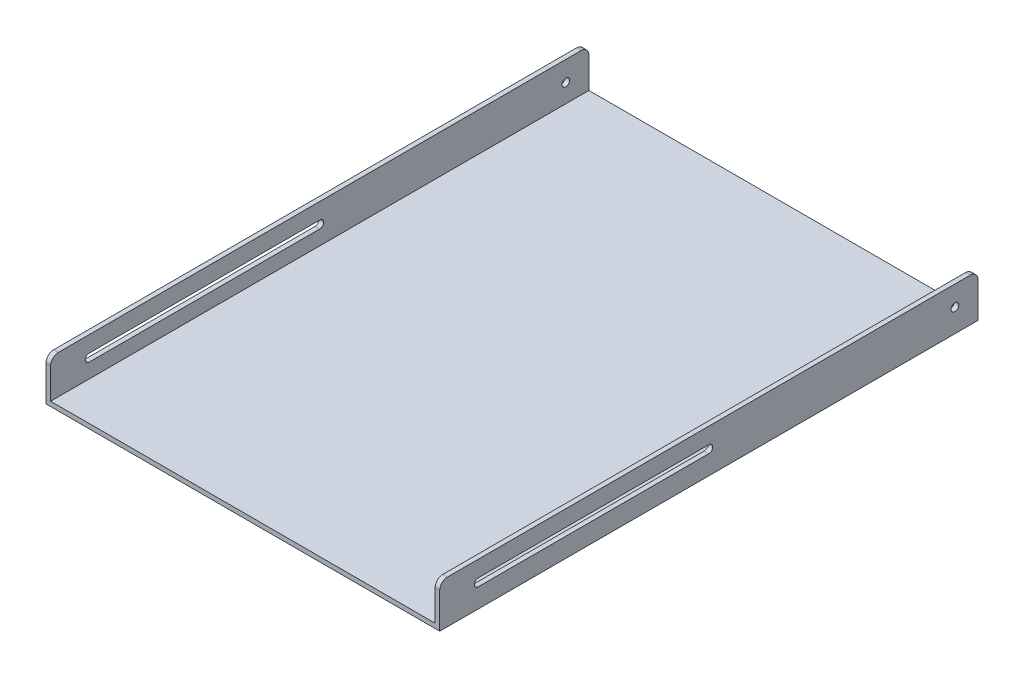
ISO-10303-21;
HEADER;
FILE_DESCRIPTION(('STEP AP214'),'2;1');
FILE_NAME('part.step','',(''),(''),'','','');
FILE_SCHEMA(('AUTOMOTIVE_DESIGN { 1 0 10303 214 1 1 1 1 }'));
ENDSEC;
DATA;
#1=APPLICATION_CONTEXT('core data for automotive mechanical design processes');
#2=APPLICATION_PROTOCOL_DEFINITION('international standard','automotive_design',2000,#1);
#3=PRODUCT_CONTEXT('',#1,'mechanical');
#4=PRODUCT('Part','Part','',(#3));
#5=PRODUCT_RELATED_PRODUCT_CATEGORY('part','',(#4));
#6=PRODUCT_DEFINITION_FORMATION('','',#4);
#7=PRODUCT_DEFINITION_CONTEXT('part definition',#1,'design');
#8=PRODUCT_DEFINITION('design','',#6,#7);
#9=PRODUCT_DEFINITION_SHAPE('','',#8);
#10=(LENGTH_UNIT() NAMED_UNIT(*) SI_UNIT(.MILLI.,.METRE.));
#11=(NAMED_UNIT(*) PLANE_ANGLE_UNIT() SI_UNIT($,.RADIAN.));
#12=(NAMED_UNIT(*) SI_UNIT($,.STERADIAN.) SOLID_ANGLE_UNIT());
#13=UNCERTAINTY_MEASURE_WITH_UNIT(LENGTH_MEASURE(1.E-05),#10,'distance_accuracy_value','');
#14=(GEOMETRIC_REPRESENTATION_CONTEXT(3) GLOBAL_UNCERTAINTY_ASSIGNED_CONTEXT((#13)) GLOBAL_UNIT_ASSIGNED_CONTEXT((#10,
#11,#12)) REPRESENTATION_CONTEXT('',''));
#15=CARTESIAN_POINT('',(0.,0.,0.));
#16=DIRECTION('',(0.,0.,1.));
#17=DIRECTION('',(1.,0.,0.));
#18=AXIS2_PLACEMENT_3D('',#15,#16,#17);
#19=CARTESIAN_POINT('',(256.,0.,350.));
#20=DIRECTION('',(-1.,0.,0.));
#21=DIRECTION('',(0.,0.,1.));
#22=AXIS2_PLACEMENT_3D('',#19,#20,#21);
#23=PLANE('',#22);
#24=CARTESIAN_POINT('',(256.,24.,-320.));
#25=DIRECTION('',(1.,0.,0.));
#26=DIRECTION('',(0.,0.,-1.));
#27=AXIS2_PLACEMENT_3D('',#24,#25,#26);
#28=CIRCLE('',#27,4.99999999999999);
#29=CARTESIAN_POINT('',(256.,24.,-325.));
#30=VERTEX_POINT('',#29);
#31=EDGE_CURVE('E209',#30,#30,#28,.T.);
#32=ORIENTED_EDGE('',*,*,#31,.F.);
#33=EDGE_LOOP('',(#32));
#34=FACE_BOUND('',#33,.T.);
#35=DIRECTION('',(0.,0.,1.));
#36=VECTOR('',#35,1.);
#37=CARTESIAN_POINT('',(256.,29.,0.));
#38=LINE('',#37,#36);
#39=CARTESIAN_POINT('',(256.,29.,0.));
#40=VERTEX_POINT('',#39);
#41=CARTESIAN_POINT('',(256.,28.9999999999999,300.));
#42=VERTEX_POINT('',#41);
#43=EDGE_CURVE('E216',#40,#42,#38,.T.);
#44=ORIENTED_EDGE('',*,*,#43,.F.);
#45=CARTESIAN_POINT('',(256.,24.,0.));
#46=DIRECTION('',(1.,0.,0.));
#47=DIRECTION('',(0.,0.,-1.));
#48=AXIS2_PLACEMENT_3D('',#45,#46,#47);
#49=CIRCLE('',#48,5.);
#50=CARTESIAN_POINT('',(256.,19.,0.));
#51=VERTEX_POINT('',#50);
#52=EDGE_CURVE('E214',#51,#40,#49,.T.);
#53=ORIENTED_EDGE('',*,*,#52,.F.);
#54=DIRECTION('',(0.,0.,-1.));
#55=VECTOR('',#54,1.);
#56=CARTESIAN_POINT('',(256.,19.,0.));
#57=LINE('',#56,#55);
#58=CARTESIAN_POINT('',(256.,18.9999999999999,300.));
#59=VERTEX_POINT('',#58);
#60=EDGE_CURVE('E203',#59,#51,#57,.T.);
#61=ORIENTED_EDGE('',*,*,#60,.F.);
#62=CARTESIAN_POINT('',(256.,23.9999999999999,300.));
#63=DIRECTION('',(1.,0.,0.));
#64=DIRECTION('',(0.,0.,-1.));
#65=AXIS2_PLACEMENT_3D('',#62,#63,#64);
#66=CIRCLE('',#65,5.);
#67=EDGE_CURVE('E206',#42,#59,#66,.T.);
#68=ORIENTED_EDGE('',*,*,#67,.F.);
#69=EDGE_LOOP('',(#44,#53,#61,#68));
#70=FACE_BOUND('',#69,.T.);
#71=DIRECTION('',(0.,1.,0.));
#72=VECTOR('',#71,1.);
#73=CARTESIAN_POINT('',(256.,0.,-350.));
#74=LINE('',#73,#72);
#75=CARTESIAN_POINT('',(256.,-6.,-350.));
#76=VERTEX_POINT('',#75);
#77=CARTESIAN_POINT('',(256.,40.,-350.));
#78=VERTEX_POINT('',#77);
#79=EDGE_CURVE('E252',#76,#78,#74,.T.);
#80=ORIENTED_EDGE('',*,*,#79,.T.);
#81=CARTESIAN_POINT('',(256.,40.,-340.));
#82=DIRECTION('',(-1.,0.,0.));
#83=DIRECTION('',(0.,0.,1.));
#84=AXIS2_PLACEMENT_3D('',#81,#82,#83);
#85=CIRCLE('',#84,10.);
#86=CARTESIAN_POINT('',(256.,50.,-340.));
#87=VERTEX_POINT('',#86);
#88=EDGE_CURVE('E322',#78,#87,#85,.F.);
#89=ORIENTED_EDGE('',*,*,#88,.T.);
#90=DIRECTION('',(0.,0.,-1.));
#91=VECTOR('',#90,1.);
#92=CARTESIAN_POINT('',(256.,50.,350.));
#93=LINE('',#92,#91);
#94=CARTESIAN_POINT('',(256.,50.,340.));
#95=VERTEX_POINT('',#94);
#96=EDGE_CURVE('E299',#95,#87,#93,.T.);
#97=ORIENTED_EDGE('',*,*,#96,.F.);
#98=CARTESIAN_POINT('',(256.,40.,340.));
#99=DIRECTION('',(-1.,0.,0.));
#100=DIRECTION('',(0.,0.,1.));
#101=AXIS2_PLACEMENT_3D('',#98,#99,#100);
#102=CIRCLE('',#101,10.);
#103=CARTESIAN_POINT('',(256.,40.,350.));
#104=VERTEX_POINT('',#103);
#105=EDGE_CURVE('E320',#95,#104,#102,.F.);
#106=ORIENTED_EDGE('',*,*,#105,.T.);
#107=DIRECTION('',(0.,1.,0.));
#108=VECTOR('',#107,1.);
#109=CARTESIAN_POINT('',(256.,0.,350.));
#110=LINE('',#109,#108);
#111=CARTESIAN_POINT('',(256.,-6.,350.));
#112=VERTEX_POINT('',#111);
#113=EDGE_CURVE('E253',#112,#104,#110,.T.);
#114=ORIENTED_EDGE('',*,*,#113,.F.);
#115=DIRECTION('',(0.,0.,-1.));
#116=VECTOR('',#115,1.);
#117=CARTESIAN_POINT('',(256.,-6.,350.));
#118=LINE('',#117,#116);
#119=EDGE_CURVE('E267',#112,#76,#118,.T.);
#120=ORIENTED_EDGE('',*,*,#119,.T.);
#121=EDGE_LOOP('',(#80,#89,#97,#106,#114,#120));
#122=FACE_BOUND('',#121,.T.);
#123=ADVANCED_FACE('F36',(#34,#70,#122),#23,.F.);
#124=CARTESIAN_POINT('',(250.,50.,350.));
#125=DIRECTION('',(0.,1.,0.));
#126=DIRECTION('',(0.,0.,1.));
#127=AXIS2_PLACEMENT_3D('',#124,#125,#126);
#128=PLANE('',#127);
#129=ORIENTED_EDGE('',*,*,#96,.T.);
#130=DIRECTION('',(1.,0.,0.));
#131=VECTOR('',#130,1.);
#132=CARTESIAN_POINT('',(250.,50.,-340.));
#133=LINE('',#132,#131);
#134=CARTESIAN_POINT('',(250.,50.,-340.));
#135=VERTEX_POINT('',#134);
#136=EDGE_CURVE('E57',#87,#135,#133,.F.);
#137=ORIENTED_EDGE('',*,*,#136,.T.);
#138=DIRECTION('',(0.,0.,-1.));
#139=VECTOR('',#138,1.);
#140=CARTESIAN_POINT('',(250.,50.,350.));
#141=LINE('',#140,#139);
#142=CARTESIAN_POINT('',(250.,50.,340.));
#143=VERTEX_POINT('',#142);
#144=EDGE_CURVE('E297',#143,#135,#141,.T.);
#145=ORIENTED_EDGE('',*,*,#144,.F.);
#146=DIRECTION('',(1.,0.,0.));
#147=VECTOR('',#146,1.);
#148=CARTESIAN_POINT('',(256.,50.,340.));
#149=LINE('',#148,#147);
#150=EDGE_CURVE('E324',#143,#95,#149,.T.);
#151=ORIENTED_EDGE('',*,*,#150,.T.);
#152=EDGE_LOOP('',(#129,#137,#145,#151));
#153=FACE_BOUND('',#152,.T.);
#154=ADVANCED_FACE('F370',(#153),#128,.T.);
#155=CARTESIAN_POINT('',(250.,0.,350.));
#156=DIRECTION('',(-1.,0.,0.));
#157=DIRECTION('',(0.,0.,1.));
#158=AXIS2_PLACEMENT_3D('',#155,#156,#157);
#159=PLANE('',#158);
#160=CARTESIAN_POINT('',(250.,24.,-320.));
#161=DIRECTION('',(-1.,0.,0.));
#162=DIRECTION('',(0.,0.,1.));
#163=AXIS2_PLACEMENT_3D('',#160,#161,#162);
#164=CIRCLE('',#163,4.99999999999999);
#165=CARTESIAN_POINT('',(250.,24.,-315.));
#166=VERTEX_POINT('',#165);
#167=EDGE_CURVE('E249',#166,#166,#164,.T.);
#168=ORIENTED_EDGE('',*,*,#167,.F.);
#169=EDGE_LOOP('',(#168));
#170=FACE_BOUND('',#169,.T.);
#171=CARTESIAN_POINT('',(250.,24.,0.));
#172=DIRECTION('',(-1.,0.,0.));
#173=DIRECTION('',(0.,0.,1.));
#174=AXIS2_PLACEMENT_3D('',#171,#172,#173);
#175=CIRCLE('',#174,5.);
#176=CARTESIAN_POINT('',(250.,29.,0.));
#177=VERTEX_POINT('',#176);
#178=CARTESIAN_POINT('',(250.,19.,0.));
#179=VERTEX_POINT('',#178);
#180=EDGE_CURVE('E244',#177,#179,#175,.T.);
#181=ORIENTED_EDGE('',*,*,#180,.F.);
#182=DIRECTION('',(0.,0.,-1.));
#183=VECTOR('',#182,1.);
#184=CARTESIAN_POINT('',(250.,28.9999999999999,350.));
#185=LINE('',#184,#183);
#186=CARTESIAN_POINT('',(250.,28.9999999999999,300.));
#187=VERTEX_POINT('',#186);
#188=EDGE_CURVE('E231',#187,#177,#185,.T.);
#189=ORIENTED_EDGE('',*,*,#188,.F.);
#190=CARTESIAN_POINT('',(250.,23.9999999999999,300.));
#191=DIRECTION('',(-1.,0.,0.));
#192=DIRECTION('',(0.,0.,1.));
#193=AXIS2_PLACEMENT_3D('',#190,#191,#192);
#194=CIRCLE('',#193,5.);
#195=CARTESIAN_POINT('',(250.,18.9999999999999,300.));
#196=VERTEX_POINT('',#195);
#197=EDGE_CURVE('E236',#196,#187,#194,.T.);
#198=ORIENTED_EDGE('',*,*,#197,.F.);
#199=DIRECTION('',(0.,0.,1.));
#200=VECTOR('',#199,1.);
#201=CARTESIAN_POINT('',(250.,18.9999999999999,350.));
#202=LINE('',#201,#200);
#203=EDGE_CURVE('E241',#179,#196,#202,.T.);
#204=ORIENTED_EDGE('',*,*,#203,.F.);
#205=EDGE_LOOP('',(#181,#189,#198,#204));
#206=FACE_BOUND('',#205,.T.);
#207=ORIENTED_EDGE('',*,*,#144,.T.);
#208=CARTESIAN_POINT('',(250.,40.,-340.));
#209=DIRECTION('',(-1.,0.,0.));
#210=DIRECTION('',(0.,0.,1.));
#211=AXIS2_PLACEMENT_3D('',#208,#209,#210);
#212=CIRCLE('',#211,10.);
#213=CARTESIAN_POINT('',(250.,40.,-350.));
#214=VERTEX_POINT('',#213);
#215=EDGE_CURVE('E330',#135,#214,#212,.T.);
#216=ORIENTED_EDGE('',*,*,#215,.T.);
#217=DIRECTION('',(0.,1.,0.));
#218=VECTOR('',#217,1.);
#219=CARTESIAN_POINT('',(250.,0.,-350.));
#220=LINE('',#219,#218);
#221=CARTESIAN_POINT('',(250.,0.,-350.));
#222=VERTEX_POINT('',#221);
#223=EDGE_CURVE('E270',#222,#214,#220,.T.);
#224=ORIENTED_EDGE('',*,*,#223,.F.);
#225=DIRECTION('',(0.,0.,-1.));
#226=VECTOR('',#225,1.);
#227=CARTESIAN_POINT('',(250.,0.,350.));
#228=LINE('',#227,#226);
#229=CARTESIAN_POINT('',(250.,0.,350.));
#230=VERTEX_POINT('',#229);
#231=EDGE_CURVE('E295',#230,#222,#228,.T.);
#232=ORIENTED_EDGE('',*,*,#231,.F.);
#233=DIRECTION('',(0.,1.,0.));
#234=VECTOR('',#233,1.);
#235=CARTESIAN_POINT('',(250.,0.,350.));
#236=LINE('',#235,#234);
#237=CARTESIAN_POINT('',(250.,40.,350.));
#238=VERTEX_POINT('',#237);
#239=EDGE_CURVE('E255',#230,#238,#236,.T.);
#240=ORIENTED_EDGE('',*,*,#239,.T.);
#241=CARTESIAN_POINT('',(250.,40.,340.));
#242=DIRECTION('',(-1.,0.,0.));
#243=DIRECTION('',(0.,0.,1.));
#244=AXIS2_PLACEMENT_3D('',#241,#242,#243);
#245=CIRCLE('',#244,10.);
#246=EDGE_CURVE('E328',#238,#143,#245,.T.);
#247=ORIENTED_EDGE('',*,*,#246,.T.);
#248=EDGE_LOOP('',(#207,#216,#224,#232,#240,#247));
#249=FACE_BOUND('',#248,.T.);
#250=ADVANCED_FACE('F368',(#170,#206,#249),#159,.T.);
#251=CARTESIAN_POINT('',(-250.,0.,350.));
#252=DIRECTION('',(0.,1.,0.));
#253=DIRECTION('',(0.,0.,1.));
#254=AXIS2_PLACEMENT_3D('',#251,#252,#253);
#255=PLANE('',#254);
#256=DIRECTION('',(1.,0.,0.));
#257=VECTOR('',#256,1.);
#258=CARTESIAN_POINT('',(-250.,0.,-350.));
#259=LINE('',#258,#257);
#260=CARTESIAN_POINT('',(-250.,0.,-350.));
#261=VERTEX_POINT('',#260);
#262=EDGE_CURVE('E273',#261,#222,#259,.T.);
#263=ORIENTED_EDGE('',*,*,#262,.F.);
#264=DIRECTION('',(0.,0.,-1.));
#265=VECTOR('',#264,1.);
#266=CARTESIAN_POINT('',(-250.,0.,350.));
#267=LINE('',#266,#265);
#268=CARTESIAN_POINT('',(-250.,0.,350.));
#269=VERTEX_POINT('',#268);
#270=EDGE_CURVE('E292',#269,#261,#267,.T.);
#271=ORIENTED_EDGE('',*,*,#270,.F.);
#272=DIRECTION('',(1.,0.,0.));
#273=VECTOR('',#272,1.);
#274=CARTESIAN_POINT('',(-250.,0.,350.));
#275=LINE('',#274,#273);
#276=EDGE_CURVE('E258',#269,#230,#275,.T.);
#277=ORIENTED_EDGE('',*,*,#276,.T.);
#278=ORIENTED_EDGE('',*,*,#231,.T.);
#279=EDGE_LOOP('',(#263,#271,#277,#278));
#280=FACE_BOUND('',#279,.T.);
#281=ADVANCED_FACE('F379',(#280),#255,.T.);
#282=CARTESIAN_POINT('',(-250.,50.,350.));
#283=DIRECTION('',(1.,0.,0.));
#284=DIRECTION('',(0.,0.,-1.));
#285=AXIS2_PLACEMENT_3D('',#282,#283,#284);
#286=PLANE('',#285);
#287=CARTESIAN_POINT('',(-250.,24.,-320.));
#288=DIRECTION('',(1.,0.,0.));
#289=DIRECTION('',(0.,0.,-1.));
#290=AXIS2_PLACEMENT_3D('',#287,#288,#289);
#291=CIRCLE('',#290,4.99999999999999);
#292=CARTESIAN_POINT('',(-250.,24.,-325.));
#293=VERTEX_POINT('',#292);
#294=EDGE_CURVE('E246',#293,#293,#291,.T.);
#295=ORIENTED_EDGE('',*,*,#294,.F.);
#296=EDGE_LOOP('',(#295));
#297=FACE_BOUND('',#296,.T.);
#298=CARTESIAN_POINT('',(-250.,24.,0.));
#299=DIRECTION('',(1.,0.,0.));
#300=DIRECTION('',(0.,0.,-1.));
#301=AXIS2_PLACEMENT_3D('',#298,#299,#300);
#302=CIRCLE('',#301,5.);
#303=CARTESIAN_POINT('',(-250.,19.,0.));
#304=VERTEX_POINT('',#303);
#305=CARTESIAN_POINT('',(-250.,29.,0.));
#306=VERTEX_POINT('',#305);
#307=EDGE_CURVE('E183',#304,#306,#302,.T.);
#308=ORIENTED_EDGE('',*,*,#307,.F.);
#309=DIRECTION('',(0.,0.,-1.));
#310=VECTOR('',#309,1.);
#311=CARTESIAN_POINT('',(-250.,18.9999999999999,350.));
#312=LINE('',#311,#310);
#313=CARTESIAN_POINT('',(-250.,18.9999999999999,300.));
#314=VERTEX_POINT('',#313);
#315=EDGE_CURVE('E239',#314,#304,#312,.T.);
#316=ORIENTED_EDGE('',*,*,#315,.F.);
#317=CARTESIAN_POINT('',(-250.,23.9999999999999,300.));
#318=DIRECTION('',(1.,0.,0.));
#319=DIRECTION('',(0.,0.,-1.));
#320=AXIS2_PLACEMENT_3D('',#317,#318,#319);
#321=CIRCLE('',#320,5.);
#322=CARTESIAN_POINT('',(-250.,28.9999999999999,300.));
#323=VERTEX_POINT('',#322);
#324=EDGE_CURVE('E234',#323,#314,#321,.T.);
#325=ORIENTED_EDGE('',*,*,#324,.F.);
#326=DIRECTION('',(0.,0.,1.));
#327=VECTOR('',#326,1.);
#328=CARTESIAN_POINT('',(-250.,28.9999999999999,350.));
#329=LINE('',#328,#327);
#330=EDGE_CURVE('E229',#306,#323,#329,.T.);
#331=ORIENTED_EDGE('',*,*,#330,.F.);
#332=EDGE_LOOP('',(#308,#316,#325,#331));
#333=FACE_BOUND('',#332,.T.);
#334=DIRECTION('',(0.,-1.,0.));
#335=VECTOR('',#334,1.);
#336=CARTESIAN_POINT('',(-250.,50.,-350.));
#337=LINE('',#336,#335);
#338=CARTESIAN_POINT('',(-250.,40.,-350.));
#339=VERTEX_POINT('',#338);
#340=EDGE_CURVE('E276',#339,#261,#337,.T.);
#341=ORIENTED_EDGE('',*,*,#340,.F.);
#342=CARTESIAN_POINT('',(-250.,40.,-340.));
#343=DIRECTION('',(1.,0.,0.));
#344=DIRECTION('',(0.,0.,-1.));
#345=AXIS2_PLACEMENT_3D('',#342,#343,#344);
#346=CIRCLE('',#345,10.);
#347=CARTESIAN_POINT('',(-250.,50.,-340.));
#348=VERTEX_POINT('',#347);
#349=EDGE_CURVE('E309',#339,#348,#346,.T.);
#350=ORIENTED_EDGE('',*,*,#349,.T.);
#351=DIRECTION('',(0.,0.,-1.));
#352=VECTOR('',#351,1.);
#353=CARTESIAN_POINT('',(-250.,50.,350.));
#354=LINE('',#353,#352);
#355=CARTESIAN_POINT('',(-250.,50.,340.));
#356=VERTEX_POINT('',#355);
#357=EDGE_CURVE('E289',#356,#348,#354,.T.);
#358=ORIENTED_EDGE('',*,*,#357,.F.);
#359=CARTESIAN_POINT('',(-250.,40.,340.));
#360=DIRECTION('',(1.,0.,0.));
#361=DIRECTION('',(0.,0.,-1.));
#362=AXIS2_PLACEMENT_3D('',#359,#360,#361);
#363=CIRCLE('',#362,10.);
#364=CARTESIAN_POINT('',(-250.,40.,350.));
#365=VERTEX_POINT('',#364);
#366=EDGE_CURVE('E307',#356,#365,#363,.T.);
#367=ORIENTED_EDGE('',*,*,#366,.T.);
#368=DIRECTION('',(0.,-1.,0.));
#369=VECTOR('',#368,1.);
#370=CARTESIAN_POINT('',(-250.,50.,350.));
#371=LINE('',#370,#369);
#372=EDGE_CURVE('E261',#365,#269,#371,.T.);
#373=ORIENTED_EDGE('',*,*,#372,.T.);
#374=ORIENTED_EDGE('',*,*,#270,.T.);
#375=EDGE_LOOP('',(#341,#350,#358,#367,#373,#374));
#376=FACE_BOUND('',#375,.T.);
#377=ADVANCED_FACE('F348',(#297,#333,#376),#286,.T.);
#378=CARTESIAN_POINT('',(-256.,50.,350.));
#379=DIRECTION('',(0.,1.,0.));
#380=DIRECTION('',(0.,0.,1.));
#381=AXIS2_PLACEMENT_3D('',#378,#379,#380);
#382=PLANE('',#381);
#383=ORIENTED_EDGE('',*,*,#357,.T.);
#384=DIRECTION('',(1.,0.,0.));
#385=VECTOR('',#384,1.);
#386=CARTESIAN_POINT('',(-256.,50.,-340.));
#387=LINE('',#386,#385);
#388=CARTESIAN_POINT('',(-256.,50.,-340.));
#389=VERTEX_POINT('',#388);
#390=EDGE_CURVE('E314',#348,#389,#387,.F.);
#391=ORIENTED_EDGE('',*,*,#390,.T.);
#392=DIRECTION('',(0.,0.,-1.));
#393=VECTOR('',#392,1.);
#394=CARTESIAN_POINT('',(-256.,50.,350.));
#395=LINE('',#394,#393);
#396=CARTESIAN_POINT('',(-256.,50.,340.));
#397=VERTEX_POINT('',#396);
#398=EDGE_CURVE('E286',#397,#389,#395,.T.);
#399=ORIENTED_EDGE('',*,*,#398,.F.);
#400=DIRECTION('',(1.,0.,0.));
#401=VECTOR('',#400,1.);
#402=CARTESIAN_POINT('',(-250.,50.,340.));
#403=LINE('',#402,#401);
#404=EDGE_CURVE('E311',#397,#356,#403,.T.);
#405=ORIENTED_EDGE('',*,*,#404,.T.);
#406=EDGE_LOOP('',(#383,#391,#399,#405));
#407=FACE_BOUND('',#406,.T.);
#408=ADVANCED_FACE('F344',(#407),#382,.T.);
#409=CARTESIAN_POINT('',(-256.,50.,350.));
#410=DIRECTION('',(1.,0.,0.));
#411=DIRECTION('',(0.,0.,-1.));
#412=AXIS2_PLACEMENT_3D('',#409,#410,#411);
#413=PLANE('',#412);
#414=CARTESIAN_POINT('',(-256.,24.,-320.));
#415=DIRECTION('',(1.,0.,0.));
#416=DIRECTION('',(0.,0.,-1.));
#417=AXIS2_PLACEMENT_3D('',#414,#415,#416);
#418=CIRCLE('',#417,4.99999999999999);
#419=CARTESIAN_POINT('',(-256.,24.,-325.));
#420=VERTEX_POINT('',#419);
#421=EDGE_CURVE('E232',#420,#420,#418,.T.);
#422=ORIENTED_EDGE('',*,*,#421,.T.);
#423=EDGE_LOOP('',(#422));
#424=FACE_BOUND('',#423,.T.);
#425=DIRECTION('',(0.,0.,-1.));
#426=VECTOR('',#425,1.);
#427=CARTESIAN_POINT('',(-256.,19.,0.));
#428=LINE('',#427,#426);
#429=CARTESIAN_POINT('',(-256.,18.9999999999999,300.));
#430=VERTEX_POINT('',#429);
#431=CARTESIAN_POINT('',(-256.,19.,0.));
#432=VERTEX_POINT('',#431);
#433=EDGE_CURVE('E202',#430,#432,#428,.T.);
#434=ORIENTED_EDGE('',*,*,#433,.T.);
#435=CARTESIAN_POINT('',(-256.,24.,0.));
#436=DIRECTION('',(1.,0.,0.));
#437=DIRECTION('',(0.,0.,-1.));
#438=AXIS2_PLACEMENT_3D('',#435,#436,#437);
#439=CIRCLE('',#438,5.);
#440=CARTESIAN_POINT('',(-256.,29.,0.));
#441=VERTEX_POINT('',#440);
#442=EDGE_CURVE('E180',#432,#441,#439,.T.);
#443=ORIENTED_EDGE('',*,*,#442,.T.);
#444=DIRECTION('',(0.,0.,1.));
#445=VECTOR('',#444,1.);
#446=CARTESIAN_POINT('',(-256.,29.,0.));
#447=LINE('',#446,#445);
#448=CARTESIAN_POINT('',(-256.,28.9999999999999,300.));
#449=VERTEX_POINT('',#448);
#450=EDGE_CURVE('E191',#441,#449,#447,.T.);
#451=ORIENTED_EDGE('',*,*,#450,.T.);
#452=CARTESIAN_POINT('',(-256.,23.9999999999999,300.));
#453=DIRECTION('',(1.,0.,0.));
#454=DIRECTION('',(0.,0.,-1.));
#455=AXIS2_PLACEMENT_3D('',#452,#453,#454);
#456=CIRCLE('',#455,5.);
#457=EDGE_CURVE('E197',#449,#430,#456,.T.);
#458=ORIENTED_EDGE('',*,*,#457,.T.);
#459=EDGE_LOOP('',(#434,#443,#451,#458));
#460=FACE_BOUND('',#459,.T.);
#461=ORIENTED_EDGE('',*,*,#398,.T.);
#462=CARTESIAN_POINT('',(-256.,40.,-340.));
#463=DIRECTION('',(1.,0.,0.));
#464=DIRECTION('',(0.,0.,-1.));
#465=AXIS2_PLACEMENT_3D('',#462,#463,#464);
#466=CIRCLE('',#465,10.);
#467=CARTESIAN_POINT('',(-256.,40.,-350.));
#468=VERTEX_POINT('',#467);
#469=EDGE_CURVE('E318',#389,#468,#466,.F.);
#470=ORIENTED_EDGE('',*,*,#469,.T.);
#471=DIRECTION('',(0.,1.,0.));
#472=VECTOR('',#471,1.);
#473=CARTESIAN_POINT('',(-256.,50.,-350.));
#474=LINE('',#473,#472);
#475=CARTESIAN_POINT('',(-256.,-6.,-350.));
#476=VERTEX_POINT('',#475);
#477=EDGE_CURVE('E278',#468,#476,#474,.F.);
#478=ORIENTED_EDGE('',*,*,#477,.T.);
#479=DIRECTION('',(0.,0.,-1.));
#480=VECTOR('',#479,1.);
#481=CARTESIAN_POINT('',(-256.,-6.,350.));
#482=LINE('',#481,#480);
#483=CARTESIAN_POINT('',(-256.,-6.,350.));
#484=VERTEX_POINT('',#483);
#485=EDGE_CURVE('E283',#484,#476,#482,.T.);
#486=ORIENTED_EDGE('',*,*,#485,.F.);
#487=DIRECTION('',(0.,1.,0.));
#488=VECTOR('',#487,1.);
#489=CARTESIAN_POINT('',(-256.,50.,350.));
#490=LINE('',#489,#488);
#491=CARTESIAN_POINT('',(-256.,40.,350.));
#492=VERTEX_POINT('',#491);
#493=EDGE_CURVE('E263',#492,#484,#490,.F.);
#494=ORIENTED_EDGE('',*,*,#493,.F.);
#495=CARTESIAN_POINT('',(-256.,40.,340.));
#496=DIRECTION('',(1.,0.,0.));
#497=DIRECTION('',(0.,0.,-1.));
#498=AXIS2_PLACEMENT_3D('',#495,#496,#497);
#499=CIRCLE('',#498,10.);
#500=EDGE_CURVE('E316',#492,#397,#499,.F.);
#501=ORIENTED_EDGE('',*,*,#500,.T.);
#502=EDGE_LOOP('',(#461,#470,#478,#486,#494,#501));
#503=FACE_BOUND('',#502,.T.);
#504=ADVANCED_FACE('F199',(#424,#460,#503),#413,.F.);
#505=CARTESIAN_POINT('',(-250.,-6.,350.));
#506=DIRECTION('',(0.,1.,0.));
#507=DIRECTION('',(0.,0.,1.));
#508=AXIS2_PLACEMENT_3D('',#505,#506,#507);
#509=PLANE('',#508);
#510=DIRECTION('',(1.,0.,0.));
#511=VECTOR('',#510,1.);
#512=CARTESIAN_POINT('',(-250.,-6.,-350.));
#513=LINE('',#512,#511);
#514=EDGE_CURVE('E256',#476,#76,#513,.T.);
#515=ORIENTED_EDGE('',*,*,#514,.T.);
#516=ORIENTED_EDGE('',*,*,#119,.F.);
#517=DIRECTION('',(1.,0.,0.));
#518=VECTOR('',#517,1.);
#519=CARTESIAN_POINT('',(-250.,-6.,350.));
#520=LINE('',#519,#518);
#521=EDGE_CURVE('E265',#484,#112,#520,.T.);
#522=ORIENTED_EDGE('',*,*,#521,.F.);
#523=ORIENTED_EDGE('',*,*,#485,.T.);
#524=EDGE_LOOP('',(#515,#516,#522,#523));
#525=FACE_BOUND('',#524,.T.);
#526=ADVANCED_FACE('F359',(#525),#509,.F.);
#527=CARTESIAN_POINT('',(0.,0.,350.));
#528=DIRECTION('',(0.,0.,-1.));
#529=DIRECTION('',(-1.,0.,0.));
#530=AXIS2_PLACEMENT_3D('',#527,#528,#529);
#531=PLANE('',#530);
#532=ORIENTED_EDGE('',*,*,#113,.T.);
#533=DIRECTION('',(1.,0.,0.));
#534=VECTOR('',#533,1.);
#535=CARTESIAN_POINT('',(250.,40.,350.));
#536=LINE('',#535,#534);
#537=EDGE_CURVE('E11',#104,#238,#536,.F.);
#538=ORIENTED_EDGE('',*,*,#537,.T.);
#539=ORIENTED_EDGE('',*,*,#239,.F.);
#540=ORIENTED_EDGE('',*,*,#276,.F.);
#541=ORIENTED_EDGE('',*,*,#372,.F.);
#542=DIRECTION('',(1.,0.,0.));
#543=VECTOR('',#542,1.);
#544=CARTESIAN_POINT('',(-256.,40.,350.));
#545=LINE('',#544,#543);
#546=EDGE_CURVE('E44',#365,#492,#545,.F.);
#547=ORIENTED_EDGE('',*,*,#546,.T.);
#548=ORIENTED_EDGE('',*,*,#493,.T.);
#549=ORIENTED_EDGE('',*,*,#521,.T.);
#550=EDGE_LOOP('',(#532,#538,#539,#540,#541,#547,#548,#549));
#551=FACE_BOUND('',#550,.T.);
#552=ADVANCED_FACE('F334',(#551),#531,.F.);
#553=CARTESIAN_POINT('',(0.,0.,-350.));
#554=DIRECTION('',(0.,0.,-1.));
#555=DIRECTION('',(-1.,0.,0.));
#556=AXIS2_PLACEMENT_3D('',#553,#554,#555);
#557=PLANE('',#556);
#558=ORIENTED_EDGE('',*,*,#477,.F.);
#559=DIRECTION('',(1.,0.,0.));
#560=VECTOR('',#559,1.);
#561=CARTESIAN_POINT('',(0.,40.,-350.));
#562=LINE('',#561,#560);
#563=EDGE_CURVE('E304',#468,#339,#562,.T.);
#564=ORIENTED_EDGE('',*,*,#563,.T.);
#565=ORIENTED_EDGE('',*,*,#340,.T.);
#566=ORIENTED_EDGE('',*,*,#262,.T.);
#567=ORIENTED_EDGE('',*,*,#223,.T.);
#568=DIRECTION('',(1.,0.,0.));
#569=VECTOR('',#568,1.);
#570=CARTESIAN_POINT('',(0.,40.,-350.));
#571=LINE('',#570,#569);
#572=EDGE_CURVE('E301',#214,#78,#571,.T.);
#573=ORIENTED_EDGE('',*,*,#572,.T.);
#574=ORIENTED_EDGE('',*,*,#79,.F.);
#575=ORIENTED_EDGE('',*,*,#514,.F.);
#576=EDGE_LOOP('',(#558,#564,#565,#566,#567,#573,#574,#575));
#577=FACE_BOUND('',#576,.T.);
#578=ADVANCED_FACE('F355',(#577),#557,.T.);
#579=CARTESIAN_POINT('',(-256.,29.,0.));
#580=DIRECTION('',(0.,1.,0.));
#581=DIRECTION('',(0.,0.,1.));
#582=AXIS2_PLACEMENT_3D('',#579,#580,#581);
#583=PLANE('',#582);
#584=ORIENTED_EDGE('',*,*,#330,.T.);
#585=DIRECTION('',(1.,0.,0.));
#586=VECTOR('',#585,1.);
#587=CARTESIAN_POINT('',(-256.,28.9999999999999,300.));
#588=LINE('',#587,#586);
#589=EDGE_CURVE('E194',#449,#323,#588,.T.);
#590=ORIENTED_EDGE('',*,*,#589,.F.);
#591=ORIENTED_EDGE('',*,*,#450,.F.);
#592=DIRECTION('',(1.,0.,0.));
#593=VECTOR('',#592,1.);
#594=CARTESIAN_POINT('',(-256.,29.,0.));
#595=LINE('',#594,#593);
#596=EDGE_CURVE('E175',#441,#306,#595,.T.);
#597=ORIENTED_EDGE('',*,*,#596,.T.);
#598=EDGE_LOOP('',(#584,#590,#591,#597));
#599=FACE_BOUND('',#598,.T.);
#600=ADVANCED_FACE('F192',(#599),#583,.F.);
#601=CARTESIAN_POINT('',(-256.,23.9999999999999,300.));
#602=DIRECTION('',(1.,0.,0.));
#603=DIRECTION('',(0.,0.,-1.));
#604=AXIS2_PLACEMENT_3D('',#601,#602,#603);
#605=CYLINDRICAL_SURFACE('',#604,5.);
#606=ORIENTED_EDGE('',*,*,#324,.T.);
#607=DIRECTION('',(1.,0.,0.));
#608=VECTOR('',#607,1.);
#609=CARTESIAN_POINT('',(-256.,18.9999999999999,300.));
#610=LINE('',#609,#608);
#611=EDGE_CURVE('E224',#430,#314,#610,.T.);
#612=ORIENTED_EDGE('',*,*,#611,.F.);
#613=ORIENTED_EDGE('',*,*,#457,.F.);
#614=ORIENTED_EDGE('',*,*,#589,.T.);
#615=EDGE_LOOP('',(#606,#612,#613,#614));
#616=FACE_BOUND('',#615,.T.);
#617=ADVANCED_FACE('F519',(#616),#605,.F.);
#618=CARTESIAN_POINT('',(-256.,19.,0.));
#619=DIRECTION('',(0.,-1.,0.));
#620=DIRECTION('',(0.,0.,-1.));
#621=AXIS2_PLACEMENT_3D('',#618,#619,#620);
#622=PLANE('',#621);
#623=ORIENTED_EDGE('',*,*,#315,.T.);
#624=DIRECTION('',(1.,0.,0.));
#625=VECTOR('',#624,1.);
#626=CARTESIAN_POINT('',(-256.,19.,0.));
#627=LINE('',#626,#625);
#628=EDGE_CURVE('E221',#432,#304,#627,.T.);
#629=ORIENTED_EDGE('',*,*,#628,.F.);
#630=ORIENTED_EDGE('',*,*,#433,.F.);
#631=ORIENTED_EDGE('',*,*,#611,.T.);
#632=EDGE_LOOP('',(#623,#629,#630,#631));
#633=FACE_BOUND('',#632,.T.);
#634=ADVANCED_FACE('F530',(#633),#622,.F.);
#635=CARTESIAN_POINT('',(-256.,24.,0.));
#636=DIRECTION('',(1.,0.,0.));
#637=DIRECTION('',(0.,0.,-1.));
#638=AXIS2_PLACEMENT_3D('',#635,#636,#637);
#639=CYLINDRICAL_SURFACE('',#638,5.);
#640=ORIENTED_EDGE('',*,*,#307,.T.);
#641=ORIENTED_EDGE('',*,*,#596,.F.);
#642=ORIENTED_EDGE('',*,*,#442,.F.);
#643=ORIENTED_EDGE('',*,*,#628,.T.);
#644=EDGE_LOOP('',(#640,#641,#642,#643));
#645=FACE_BOUND('',#644,.T.);
#646=ADVANCED_FACE('F177',(#645),#639,.F.);
#647=CARTESIAN_POINT('',(-256.,24.,-320.));
#648=DIRECTION('',(1.,0.,0.));
#649=DIRECTION('',(0.,0.,-1.));
#650=AXIS2_PLACEMENT_3D('',#647,#648,#649);
#651=CYLINDRICAL_SURFACE('',#650,4.99999999999999);
#652=ORIENTED_EDGE('',*,*,#294,.T.);
#653=EDGE_LOOP('',(#652));
#654=FACE_BOUND('',#653,.T.);
#655=ORIENTED_EDGE('',*,*,#421,.F.);
#656=EDGE_LOOP('',(#655));
#657=FACE_BOUND('',#656,.T.);
#658=ADVANCED_FACE('F498',(#654,#657),#651,.F.);
#659=ORIENTED_EDGE('',*,*,#180,.T.);
#660=EDGE_CURVE('E223',#179,#51,#627,.T.);
#661=ORIENTED_EDGE('',*,*,#660,.T.);
#662=ORIENTED_EDGE('',*,*,#52,.T.);
#663=EDGE_CURVE('E187',#177,#40,#595,.T.);
#664=ORIENTED_EDGE('',*,*,#663,.F.);
#665=EDGE_LOOP('',(#659,#661,#662,#664));
#666=FACE_BOUND('',#665,.T.);
#667=ADVANCED_FACE('F527',(#666),#639,.F.);
#668=ORIENTED_EDGE('',*,*,#203,.T.);
#669=EDGE_CURVE('E227',#196,#59,#610,.T.);
#670=ORIENTED_EDGE('',*,*,#669,.T.);
#671=ORIENTED_EDGE('',*,*,#60,.T.);
#672=ORIENTED_EDGE('',*,*,#660,.F.);
#673=EDGE_LOOP('',(#668,#670,#671,#672));
#674=FACE_BOUND('',#673,.T.);
#675=ADVANCED_FACE('F516',(#674),#622,.F.);
#676=ORIENTED_EDGE('',*,*,#197,.T.);
#677=EDGE_CURVE('E186',#187,#42,#588,.T.);
#678=ORIENTED_EDGE('',*,*,#677,.T.);
#679=ORIENTED_EDGE('',*,*,#67,.T.);
#680=ORIENTED_EDGE('',*,*,#669,.F.);
#681=EDGE_LOOP('',(#676,#678,#679,#680));
#682=FACE_BOUND('',#681,.T.);
#683=ADVANCED_FACE('F506',(#682),#605,.F.);
#684=ORIENTED_EDGE('',*,*,#188,.T.);
#685=ORIENTED_EDGE('',*,*,#663,.T.);
#686=ORIENTED_EDGE('',*,*,#43,.T.);
#687=ORIENTED_EDGE('',*,*,#677,.F.);
#688=EDGE_LOOP('',(#684,#685,#686,#687));
#689=FACE_BOUND('',#688,.T.);
#690=ADVANCED_FACE('F495',(#689),#583,.F.);
#691=ORIENTED_EDGE('',*,*,#167,.T.);
#692=EDGE_LOOP('',(#691));
#693=FACE_BOUND('',#692,.T.);
#694=ORIENTED_EDGE('',*,*,#31,.T.);
#695=EDGE_LOOP('',(#694));
#696=FACE_BOUND('',#695,.T.);
#697=ADVANCED_FACE('F402',(#693,#696),#651,.F.);
#698=CARTESIAN_POINT('',(0.,40.,-340.));
#699=DIRECTION('',(1.,0.,0.));
#700=DIRECTION('',(0.,0.,-1.));
#701=AXIS2_PLACEMENT_3D('',#698,#699,#700);
#702=CYLINDRICAL_SURFACE('',#701,10.);
#703=ORIENTED_EDGE('',*,*,#469,.F.);
#704=ORIENTED_EDGE('',*,*,#390,.F.);
#705=ORIENTED_EDGE('',*,*,#349,.F.);
#706=ORIENTED_EDGE('',*,*,#563,.F.);
#707=EDGE_LOOP('',(#703,#704,#705,#706));
#708=FACE_BOUND('',#707,.T.);
#709=ADVANCED_FACE('F352',(#708),#702,.T.);
#710=CARTESIAN_POINT('',(0.,40.,-340.));
#711=DIRECTION('',(1.,0.,0.));
#712=DIRECTION('',(0.,0.,-1.));
#713=AXIS2_PLACEMENT_3D('',#710,#711,#712);
#714=CYLINDRICAL_SURFACE('',#713,10.);
#715=ORIENTED_EDGE('',*,*,#215,.F.);
#716=ORIENTED_EDGE('',*,*,#136,.F.);
#717=ORIENTED_EDGE('',*,*,#88,.F.);
#718=ORIENTED_EDGE('',*,*,#572,.F.);
#719=EDGE_LOOP('',(#715,#716,#717,#718));
#720=FACE_BOUND('',#719,.T.);
#721=ADVANCED_FACE('F374',(#720),#714,.T.);
#722=CARTESIAN_POINT('',(250.,40.,340.));
#723=DIRECTION('',(-1.,0.,0.));
#724=DIRECTION('',(0.,0.,1.));
#725=AXIS2_PLACEMENT_3D('',#722,#723,#724);
#726=CYLINDRICAL_SURFACE('',#725,10.);
#727=ORIENTED_EDGE('',*,*,#246,.F.);
#728=ORIENTED_EDGE('',*,*,#537,.F.);
#729=ORIENTED_EDGE('',*,*,#105,.F.);
#730=ORIENTED_EDGE('',*,*,#150,.F.);
#731=EDGE_LOOP('',(#727,#728,#729,#730));
#732=FACE_BOUND('',#731,.T.);
#733=ADVANCED_FACE('F365',(#732),#726,.T.);
#734=CARTESIAN_POINT('',(-256.,40.,340.));
#735=DIRECTION('',(-1.,0.,0.));
#736=DIRECTION('',(0.,0.,1.));
#737=AXIS2_PLACEMENT_3D('',#734,#735,#736);
#738=CYLINDRICAL_SURFACE('',#737,10.);
#739=ORIENTED_EDGE('',*,*,#500,.F.);
#740=ORIENTED_EDGE('',*,*,#546,.F.);
#741=ORIENTED_EDGE('',*,*,#366,.F.);
#742=ORIENTED_EDGE('',*,*,#404,.F.);
#743=EDGE_LOOP('',(#739,#740,#741,#742));
#744=FACE_BOUND('',#743,.T.);
#745=ADVANCED_FACE('F38',(#744),#738,.T.);
#746=CLOSED_SHELL('',(#123,#154,#250,#281,#377,#408,#504,#526,#552,#578,#600,#617,#634,#646,
#658,#667,#675,#683,#690,#697,#709,#721,#733,#745));
#747=MANIFOLD_SOLID_BREP('B2',#746);
#748=ADVANCED_BREP_SHAPE_REPRESENTATION('',(#18,#747),#14);
#749=SHAPE_DEFINITION_REPRESENTATION(#9,#748);
ENDSEC;
END-ISO-10303-21;
